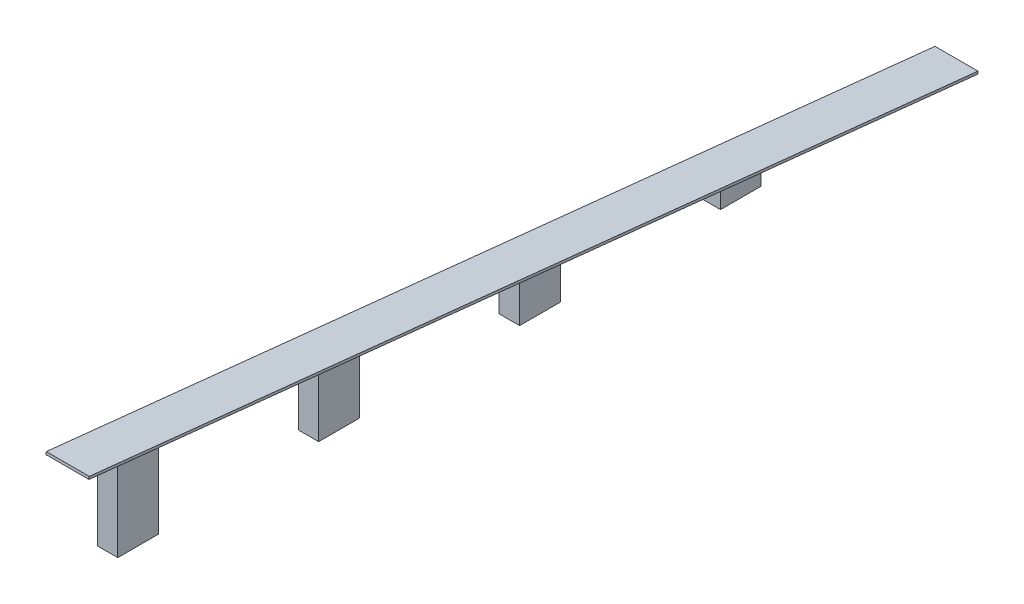
ISO-10303-21;
HEADER;
FILE_DESCRIPTION(('STEP AP214'),'2;1');
FILE_NAME('part.step','',(''),(''),'','','');
FILE_SCHEMA(('AUTOMOTIVE_DESIGN { 1 0 10303 214 1 1 1 1 }'));
ENDSEC;
DATA;
#1=APPLICATION_CONTEXT('core data for automotive mechanical design processes');
#2=APPLICATION_PROTOCOL_DEFINITION('international standard','automotive_design',2000,#1);
#3=PRODUCT_CONTEXT('',#1,'mechanical');
#4=PRODUCT('Part','Part','',(#3));
#5=PRODUCT_RELATED_PRODUCT_CATEGORY('part','',(#4));
#6=PRODUCT_DEFINITION_FORMATION('','',#4);
#7=PRODUCT_DEFINITION_CONTEXT('part definition',#1,'design');
#8=PRODUCT_DEFINITION('design','',#6,#7);
#9=PRODUCT_DEFINITION_SHAPE('','',#8);
#10=(LENGTH_UNIT() NAMED_UNIT(*) SI_UNIT(.MILLI.,.METRE.));
#11=(NAMED_UNIT(*) PLANE_ANGLE_UNIT() SI_UNIT($,.RADIAN.));
#12=(NAMED_UNIT(*) SI_UNIT($,.STERADIAN.) SOLID_ANGLE_UNIT());
#13=UNCERTAINTY_MEASURE_WITH_UNIT(LENGTH_MEASURE(1.E-05),#10,'distance_accuracy_value','');
#14=(GEOMETRIC_REPRESENTATION_CONTEXT(3) GLOBAL_UNCERTAINTY_ASSIGNED_CONTEXT((#13)) GLOBAL_UNIT_ASSIGNED_CONTEXT((#10,
#11,#12)) REPRESENTATION_CONTEXT('',''));
#15=CARTESIAN_POINT('',(0.,0.,0.));
#16=DIRECTION('',(0.,0.,1.));
#17=DIRECTION('',(1.,0.,0.));
#18=AXIS2_PLACEMENT_3D('',#15,#16,#17);
#19=CARTESIAN_POINT('',(42.6999999999999,-199.318851276045,-1516.44312212912));
#20=DIRECTION('',(0.,0.,-1.));
#21=DIRECTION('',(-1.,0.,0.));
#22=AXIS2_PLACEMENT_3D('',#19,#20,#21);
#23=PLANE('',#22);
#24=DIRECTION('',(0.,-1.,0.));
#25=VECTOR('',#24,1.);
#26=CARTESIAN_POINT('',(17.2999999999999,-199.318851276045,-1516.44312212912));
#27=LINE('',#26,#25);
#28=CARTESIAN_POINT('',(17.2999999999999,-167.058705320823,-1516.44312212912));
#29=VERTEX_POINT('',#28);
#30=CARTESIAN_POINT('',(17.2999999999999,-199.318851276045,-1516.44312212912));
#31=VERTEX_POINT('',#30);
#32=EDGE_CURVE('E12',#29,#31,#27,.T.);
#33=ORIENTED_EDGE('',*,*,#32,.T.);
#34=DIRECTION('',(-1.,0.,0.));
#35=VECTOR('',#34,1.);
#36=CARTESIAN_POINT('',(42.6999999999999,-199.318851276045,-1516.44312212912));
#37=LINE('',#36,#35);
#38=CARTESIAN_POINT('',(42.6999999999999,-199.318851276045,-1516.44312212912));
#39=VERTEX_POINT('',#38);
#40=EDGE_CURVE('E129',#39,#31,#37,.T.);
#41=ORIENTED_EDGE('',*,*,#40,.F.);
#42=DIRECTION('',(0.,-1.,0.));
#43=VECTOR('',#42,1.);
#44=CARTESIAN_POINT('',(42.6999999999999,-199.318851276045,-1516.44312212912));
#45=LINE('',#44,#43);
#46=CARTESIAN_POINT('',(42.6999999999999,-167.058705320823,-1516.44312212912));
#47=VERTEX_POINT('',#46);
#48=EDGE_CURVE('E62',#47,#39,#45,.T.);
#49=ORIENTED_EDGE('',*,*,#48,.F.);
#50=DIRECTION('',(-1.,0.,0.));
#51=VECTOR('',#50,1.);
#52=CARTESIAN_POINT('',(42.6999999999999,-167.058705320823,-1516.44312212912));
#53=LINE('',#52,#51);
#54=EDGE_CURVE('E117',#47,#29,#53,.T.);
#55=ORIENTED_EDGE('',*,*,#54,.T.);
#56=EDGE_LOOP('',(#33,#41,#49,#55));
#57=FACE_BOUND('',#56,.T.);
#58=ADVANCED_FACE('F58',(#57),#23,.F.);
#59=CARTESIAN_POINT('',(42.6999999999999,-199.318851276045,-1567.24312212912));
#60=DIRECTION('',(0.,1.,0.));
#61=DIRECTION('',(0.,0.,1.));
#62=AXIS2_PLACEMENT_3D('',#59,#60,#61);
#63=PLANE('',#62);
#64=DIRECTION('',(0.,0.,-1.));
#65=VECTOR('',#64,1.);
#66=CARTESIAN_POINT('',(17.2999999999999,-199.318851276045,-1567.24312212912));
#67=LINE('',#66,#65);
#68=CARTESIAN_POINT('',(17.2999999999999,-199.318851276045,-1567.24312212912));
#69=VERTEX_POINT('',#68);
#70=EDGE_CURVE('E68',#31,#69,#67,.T.);
#71=ORIENTED_EDGE('',*,*,#70,.T.);
#72=DIRECTION('',(-1.,0.,0.));
#73=VECTOR('',#72,1.);
#74=CARTESIAN_POINT('',(42.6999999999999,-199.318851276045,-1567.24312212912));
#75=LINE('',#74,#73);
#76=CARTESIAN_POINT('',(42.6999999999999,-199.318851276045,-1567.24312212912));
#77=VERTEX_POINT('',#76);
#78=EDGE_CURVE('E113',#77,#69,#75,.T.);
#79=ORIENTED_EDGE('',*,*,#78,.F.);
#80=DIRECTION('',(0.,0.,-1.));
#81=VECTOR('',#80,1.);
#82=CARTESIAN_POINT('',(42.6999999999999,-199.318851276045,-1567.24312212912));
#83=LINE('',#82,#81);
#84=EDGE_CURVE('E92',#39,#77,#83,.T.);
#85=ORIENTED_EDGE('',*,*,#84,.F.);
#86=ORIENTED_EDGE('',*,*,#40,.T.);
#87=EDGE_LOOP('',(#71,#79,#85,#86));
#88=FACE_BOUND('',#87,.T.);
#89=ADVANCED_FACE('F132',(#88),#63,.F.);
#90=CARTESIAN_POINT('',(42.6999999999999,-172.398000472319,-1567.24312212912));
#91=DIRECTION('',(0.,0.,1.));
#92=DIRECTION('',(1.,0.,0.));
#93=AXIS2_PLACEMENT_3D('',#90,#91,#92);
#94=PLANE('',#93);
#95=DIRECTION('',(0.,1.,0.));
#96=VECTOR('',#95,1.);
#97=CARTESIAN_POINT('',(17.2999999999999,-172.398000472319,-1567.24312212912));
#98=LINE('',#97,#96);
#99=CARTESIAN_POINT('',(17.2999999999999,-172.398000472319,-1567.24312212912));
#100=VERTEX_POINT('',#99);
#101=EDGE_CURVE('E108',#69,#100,#98,.T.);
#102=ORIENTED_EDGE('',*,*,#101,.T.);
#103=DIRECTION('',(-1.,0.,0.));
#104=VECTOR('',#103,1.);
#105=CARTESIAN_POINT('',(42.6999999999999,-172.398000472319,-1567.24312212912));
#106=LINE('',#105,#104);
#107=CARTESIAN_POINT('',(42.6999999999999,-172.398000472319,-1567.24312212912));
#108=VERTEX_POINT('',#107);
#109=EDGE_CURVE('E111',#108,#100,#106,.T.);
#110=ORIENTED_EDGE('',*,*,#109,.F.);
#111=DIRECTION('',(0.,1.,0.));
#112=VECTOR('',#111,1.);
#113=CARTESIAN_POINT('',(42.6999999999999,-172.398000472319,-1567.24312212912));
#114=LINE('',#113,#112);
#115=EDGE_CURVE('E125',#77,#108,#114,.T.);
#116=ORIENTED_EDGE('',*,*,#115,.F.);
#117=ORIENTED_EDGE('',*,*,#78,.T.);
#118=EDGE_LOOP('',(#102,#110,#116,#117));
#119=FACE_BOUND('',#118,.T.);
#120=ADVANCED_FACE('F109',(#119),#94,.F.);
#121=CARTESIAN_POINT('',(42.6999999999999,-167.058705320823,-1516.44312212912));
#122=DIRECTION('',(0.,-0.994521895368274,0.104528463267647));
#123=DIRECTION('',(0.,-0.104528463267647,-0.994521895368274));
#124=AXIS2_PLACEMENT_3D('',#121,#122,#123);
#125=PLANE('',#124);
#126=DIRECTION('',(0.,0.104528463267647,0.994521895368274));
#127=VECTOR('',#126,1.);
#128=CARTESIAN_POINT('',(17.2999999999999,-167.058705320823,-1516.44312212912));
#129=LINE('',#128,#127);
#130=EDGE_CURVE('E102',#100,#29,#129,.T.);
#131=ORIENTED_EDGE('',*,*,#130,.T.);
#132=ORIENTED_EDGE('',*,*,#54,.F.);
#133=DIRECTION('',(0.,0.104528463267647,0.994521895368274));
#134=VECTOR('',#133,1.);
#135=CARTESIAN_POINT('',(42.6999999999999,-167.058705320823,-1516.44312212912));
#136=LINE('',#135,#134);
#137=EDGE_CURVE('E116',#108,#47,#136,.T.);
#138=ORIENTED_EDGE('',*,*,#137,.F.);
#139=ORIENTED_EDGE('',*,*,#109,.T.);
#140=EDGE_LOOP('',(#131,#132,#138,#139));
#141=FACE_BOUND('',#140,.T.);
#142=ADVANCED_FACE('F115',(#141),#125,.F.);
#143=CARTESIAN_POINT('',(42.6999999999998,0.,0.));
#144=DIRECTION('',(1.,0.,0.));
#145=DIRECTION('',(0.,0.,-1.));
#146=AXIS2_PLACEMENT_3D('',#143,#144,#145);
#147=PLANE('',#146);
#148=ORIENTED_EDGE('',*,*,#48,.T.);
#149=ORIENTED_EDGE('',*,*,#84,.T.);
#150=ORIENTED_EDGE('',*,*,#115,.T.);
#151=ORIENTED_EDGE('',*,*,#137,.T.);
#152=EDGE_LOOP('',(#148,#149,#150,#151));
#153=FACE_BOUND('',#152,.T.);
#154=ADVANCED_FACE('F60',(#153),#147,.T.);
#155=CARTESIAN_POINT('',(17.2999999999998,0.,0.));
#156=DIRECTION('',(1.,0.,0.));
#157=DIRECTION('',(0.,0.,-1.));
#158=AXIS2_PLACEMENT_3D('',#155,#156,#157);
#159=PLANE('',#158);
#160=ORIENTED_EDGE('',*,*,#32,.F.);
#161=ORIENTED_EDGE('',*,*,#130,.F.);
#162=ORIENTED_EDGE('',*,*,#101,.F.);
#163=ORIENTED_EDGE('',*,*,#70,.F.);
#164=EDGE_LOOP('',(#160,#161,#162,#163));
#165=FACE_BOUND('',#164,.T.);
#166=ADVANCED_FACE('F119',(#165),#159,.F.);
#167=CLOSED_SHELL('',(#58,#89,#120,#142,#154,#166));
#168=MANIFOLD_SOLID_BREP('B2',#167);
#169=CARTESIAN_POINT('',(42.6999999999999,-199.318851276045,-1265.64312212913));
#170=DIRECTION('',(0.,0.,-1.));
#171=DIRECTION('',(-1.,0.,0.));
#172=AXIS2_PLACEMENT_3D('',#169,#170,#171);
#173=PLANE('',#172);
#174=DIRECTION('',(0.,-1.,0.));
#175=VECTOR('',#174,1.);
#176=CARTESIAN_POINT('',(17.2999999999999,-199.318851276045,-1265.64312212913));
#177=LINE('',#176,#175);
#178=CARTESIAN_POINT('',(17.2999999999999,-140.698563116193,-1265.64312212913));
#179=VERTEX_POINT('',#178);
#180=CARTESIAN_POINT('',(17.2999999999999,-199.318851276045,-1265.64312212913));
#181=VERTEX_POINT('',#180);
#182=EDGE_CURVE('E56',#179,#181,#177,.T.);
#183=ORIENTED_EDGE('',*,*,#182,.T.);
#184=DIRECTION('',(-1.,0.,0.));
#185=VECTOR('',#184,1.);
#186=CARTESIAN_POINT('',(42.6999999999999,-199.318851276045,-1265.64312212913));
#187=LINE('',#186,#185);
#188=CARTESIAN_POINT('',(42.6999999999999,-199.318851276045,-1265.64312212913));
#189=VERTEX_POINT('',#188);
#190=EDGE_CURVE('E263',#189,#181,#187,.T.);
#191=ORIENTED_EDGE('',*,*,#190,.F.);
#192=DIRECTION('',(0.,-1.,0.));
#193=VECTOR('',#192,1.);
#194=CARTESIAN_POINT('',(42.6999999999999,-199.318851276045,-1265.64312212913));
#195=LINE('',#194,#193);
#196=CARTESIAN_POINT('',(42.6999999999999,-140.698563116193,-1265.64312212913));
#197=VERTEX_POINT('',#196);
#198=EDGE_CURVE('E196',#197,#189,#195,.T.);
#199=ORIENTED_EDGE('',*,*,#198,.F.);
#200=DIRECTION('',(-1.,0.,0.));
#201=VECTOR('',#200,1.);
#202=CARTESIAN_POINT('',(42.6999999999999,-140.698563116193,-1265.64312212913));
#203=LINE('',#202,#201);
#204=EDGE_CURVE('E251',#197,#179,#203,.T.);
#205=ORIENTED_EDGE('',*,*,#204,.T.);
#206=EDGE_LOOP('',(#183,#191,#199,#205));
#207=FACE_BOUND('',#206,.T.);
#208=ADVANCED_FACE('F192',(#207),#173,.F.);
#209=CARTESIAN_POINT('',(42.6999999999999,-199.318851276045,-1316.44312212912));
#210=DIRECTION('',(0.,1.,0.));
#211=DIRECTION('',(-1.,0.,0.));
#212=AXIS2_PLACEMENT_3D('',#209,#210,#211);
#213=PLANE('',#212);
#214=DIRECTION('',(0.,0.,-1.));
#215=VECTOR('',#214,1.);
#216=CARTESIAN_POINT('',(17.2999999999999,-199.318851276045,-1316.44312212912));
#217=LINE('',#216,#215);
#218=CARTESIAN_POINT('',(17.2999999999999,-199.318851276045,-1316.44312212912));
#219=VERTEX_POINT('',#218);
#220=EDGE_CURVE('E202',#181,#219,#217,.T.);
#221=ORIENTED_EDGE('',*,*,#220,.T.);
#222=DIRECTION('',(-1.,0.,0.));
#223=VECTOR('',#222,1.);
#224=CARTESIAN_POINT('',(42.6999999999999,-199.318851276045,-1316.44312212912));
#225=LINE('',#224,#223);
#226=CARTESIAN_POINT('',(42.6999999999999,-199.318851276045,-1316.44312212912));
#227=VERTEX_POINT('',#226);
#228=EDGE_CURVE('E247',#227,#219,#225,.T.);
#229=ORIENTED_EDGE('',*,*,#228,.F.);
#230=DIRECTION('',(0.,0.,-1.));
#231=VECTOR('',#230,1.);
#232=CARTESIAN_POINT('',(42.6999999999999,-199.318851276045,-1316.44312212912));
#233=LINE('',#232,#231);
#234=EDGE_CURVE('E226',#189,#227,#233,.T.);
#235=ORIENTED_EDGE('',*,*,#234,.F.);
#236=ORIENTED_EDGE('',*,*,#190,.T.);
#237=EDGE_LOOP('',(#221,#229,#235,#236));
#238=FACE_BOUND('',#237,.T.);
#239=ADVANCED_FACE('F266',(#238),#213,.F.);
#240=CARTESIAN_POINT('',(42.6999999999999,-146.037858267689,-1316.44312212912));
#241=DIRECTION('',(0.,0.,1.));
#242=DIRECTION('',(1.,0.,0.));
#243=AXIS2_PLACEMENT_3D('',#240,#241,#242);
#244=PLANE('',#243);
#245=DIRECTION('',(0.,1.,0.));
#246=VECTOR('',#245,1.);
#247=CARTESIAN_POINT('',(17.2999999999999,-146.037858267689,-1316.44312212912));
#248=LINE('',#247,#246);
#249=CARTESIAN_POINT('',(17.2999999999999,-146.037858267689,-1316.44312212912));
#250=VERTEX_POINT('',#249);
#251=EDGE_CURVE('E242',#219,#250,#248,.T.);
#252=ORIENTED_EDGE('',*,*,#251,.T.);
#253=DIRECTION('',(-1.,0.,0.));
#254=VECTOR('',#253,1.);
#255=CARTESIAN_POINT('',(42.6999999999999,-146.037858267689,-1316.44312212912));
#256=LINE('',#255,#254);
#257=CARTESIAN_POINT('',(42.6999999999999,-146.037858267689,-1316.44312212912));
#258=VERTEX_POINT('',#257);
#259=EDGE_CURVE('E245',#258,#250,#256,.T.);
#260=ORIENTED_EDGE('',*,*,#259,.F.);
#261=DIRECTION('',(0.,1.,0.));
#262=VECTOR('',#261,1.);
#263=CARTESIAN_POINT('',(42.6999999999999,-146.037858267689,-1316.44312212912));
#264=LINE('',#263,#262);
#265=EDGE_CURVE('E259',#227,#258,#264,.T.);
#266=ORIENTED_EDGE('',*,*,#265,.F.);
#267=ORIENTED_EDGE('',*,*,#228,.T.);
#268=EDGE_LOOP('',(#252,#260,#266,#267));
#269=FACE_BOUND('',#268,.T.);
#270=ADVANCED_FACE('F243',(#269),#244,.F.);
#271=CARTESIAN_POINT('',(42.6999999999999,-140.698563116193,-1265.64312212913));
#272=DIRECTION('',(0.,-0.994521895368274,0.104528463267647));
#273=DIRECTION('',(0.,-0.104528463267647,-0.994521895368274));
#274=AXIS2_PLACEMENT_3D('',#271,#272,#273);
#275=PLANE('',#274);
#276=DIRECTION('',(0.,0.104528463267647,0.994521895368274));
#277=VECTOR('',#276,1.);
#278=CARTESIAN_POINT('',(17.2999999999999,-140.698563116193,-1265.64312212913));
#279=LINE('',#278,#277);
#280=EDGE_CURVE('E236',#250,#179,#279,.T.);
#281=ORIENTED_EDGE('',*,*,#280,.T.);
#282=ORIENTED_EDGE('',*,*,#204,.F.);
#283=DIRECTION('',(0.,0.104528463267647,0.994521895368274));
#284=VECTOR('',#283,1.);
#285=CARTESIAN_POINT('',(42.6999999999999,-140.698563116193,-1265.64312212913));
#286=LINE('',#285,#284);
#287=EDGE_CURVE('E250',#258,#197,#286,.T.);
#288=ORIENTED_EDGE('',*,*,#287,.F.);
#289=ORIENTED_EDGE('',*,*,#259,.T.);
#290=EDGE_LOOP('',(#281,#282,#288,#289));
#291=FACE_BOUND('',#290,.T.);
#292=ADVANCED_FACE('F249',(#291),#275,.F.);
#293=CARTESIAN_POINT('',(42.6999999999998,0.,0.));
#294=DIRECTION('',(1.,0.,0.));
#295=DIRECTION('',(0.,0.,-1.));
#296=AXIS2_PLACEMENT_3D('',#293,#294,#295);
#297=PLANE('',#296);
#298=ORIENTED_EDGE('',*,*,#198,.T.);
#299=ORIENTED_EDGE('',*,*,#234,.T.);
#300=ORIENTED_EDGE('',*,*,#265,.T.);
#301=ORIENTED_EDGE('',*,*,#287,.T.);
#302=EDGE_LOOP('',(#298,#299,#300,#301));
#303=FACE_BOUND('',#302,.T.);
#304=ADVANCED_FACE('F194',(#303),#297,.T.);
#305=CARTESIAN_POINT('',(17.2999999999998,0.,0.));
#306=DIRECTION('',(1.,0.,0.));
#307=DIRECTION('',(0.,0.,-1.));
#308=AXIS2_PLACEMENT_3D('',#305,#306,#307);
#309=PLANE('',#308);
#310=ORIENTED_EDGE('',*,*,#182,.F.);
#311=ORIENTED_EDGE('',*,*,#280,.F.);
#312=ORIENTED_EDGE('',*,*,#251,.F.);
#313=ORIENTED_EDGE('',*,*,#220,.F.);
#314=EDGE_LOOP('',(#310,#311,#312,#313));
#315=FACE_BOUND('',#314,.T.);
#316=ADVANCED_FACE('F253',(#315),#309,.F.);
#317=CLOSED_SHELL('',(#208,#239,#270,#292,#304,#316));
#318=MANIFOLD_SOLID_BREP('B6',#317);
#319=CARTESIAN_POINT('',(42.6999999999999,-114.338420911563,-1014.84312212913));
#320=DIRECTION('',(0.,-0.994521895368274,0.104528463267647));
#321=DIRECTION('',(0.,-0.104528463267647,-0.994521895368274));
#322=AXIS2_PLACEMENT_3D('',#319,#320,#321);
#323=PLANE('',#322);
#324=DIRECTION('',(0.,0.104528463267647,0.994521895368274));
#325=VECTOR('',#324,1.);
#326=CARTESIAN_POINT('',(17.2999999999999,-114.338420911563,-1014.84312212913));
#327=LINE('',#326,#325);
#328=CARTESIAN_POINT('',(17.2999999999999,-119.677716063059,-1065.64312212913));
#329=VERTEX_POINT('',#328);
#330=CARTESIAN_POINT('',(17.2999999999999,-114.338420911563,-1014.84312212913));
#331=VERTEX_POINT('',#330);
#332=EDGE_CURVE('E190',#329,#331,#327,.T.);
#333=ORIENTED_EDGE('',*,*,#332,.T.);
#334=DIRECTION('',(-1.,0.,0.));
#335=VECTOR('',#334,1.);
#336=CARTESIAN_POINT('',(42.6999999999999,-114.338420911563,-1014.84312212913));
#337=LINE('',#336,#335);
#338=CARTESIAN_POINT('',(42.6999999999999,-114.338420911563,-1014.84312212913));
#339=VERTEX_POINT('',#338);
#340=EDGE_CURVE('E397',#339,#331,#337,.T.);
#341=ORIENTED_EDGE('',*,*,#340,.F.);
#342=DIRECTION('',(0.,0.104528463267647,0.994521895368274));
#343=VECTOR('',#342,1.);
#344=CARTESIAN_POINT('',(42.6999999999999,-114.338420911563,-1014.84312212913));
#345=LINE('',#344,#343);
#346=CARTESIAN_POINT('',(42.6999999999999,-119.677716063059,-1065.64312212913));
#347=VERTEX_POINT('',#346);
#348=EDGE_CURVE('E330',#347,#339,#345,.T.);
#349=ORIENTED_EDGE('',*,*,#348,.F.);
#350=DIRECTION('',(-1.,0.,0.));
#351=VECTOR('',#350,1.);
#352=CARTESIAN_POINT('',(42.6999999999999,-119.677716063059,-1065.64312212913));
#353=LINE('',#352,#351);
#354=EDGE_CURVE('E385',#347,#329,#353,.T.);
#355=ORIENTED_EDGE('',*,*,#354,.T.);
#356=EDGE_LOOP('',(#333,#341,#349,#355));
#357=FACE_BOUND('',#356,.T.);
#358=ADVANCED_FACE('F326',(#357),#323,.F.);
#359=CARTESIAN_POINT('',(42.6999999999999,-199.318851276045,-1014.84312212913));
#360=DIRECTION('',(0.,0.,-1.));
#361=DIRECTION('',(-1.,0.,0.));
#362=AXIS2_PLACEMENT_3D('',#359,#360,#361);
#363=PLANE('',#362);
#364=DIRECTION('',(0.,-1.,0.));
#365=VECTOR('',#364,1.);
#366=CARTESIAN_POINT('',(17.2999999999999,-199.318851276045,-1014.84312212913));
#367=LINE('',#366,#365);
#368=CARTESIAN_POINT('',(17.2999999999999,-199.318851276045,-1014.84312212913));
#369=VERTEX_POINT('',#368);
#370=EDGE_CURVE('E336',#331,#369,#367,.T.);
#371=ORIENTED_EDGE('',*,*,#370,.T.);
#372=DIRECTION('',(-1.,0.,0.));
#373=VECTOR('',#372,1.);
#374=CARTESIAN_POINT('',(42.6999999999999,-199.318851276045,-1014.84312212913));
#375=LINE('',#374,#373);
#376=CARTESIAN_POINT('',(42.6999999999999,-199.318851276045,-1014.84312212913));
#377=VERTEX_POINT('',#376);
#378=EDGE_CURVE('E381',#377,#369,#375,.T.);
#379=ORIENTED_EDGE('',*,*,#378,.F.);
#380=DIRECTION('',(0.,-1.,0.));
#381=VECTOR('',#380,1.);
#382=CARTESIAN_POINT('',(42.6999999999999,-199.318851276045,-1014.84312212913));
#383=LINE('',#382,#381);
#384=EDGE_CURVE('E360',#339,#377,#383,.T.);
#385=ORIENTED_EDGE('',*,*,#384,.F.);
#386=ORIENTED_EDGE('',*,*,#340,.T.);
#387=EDGE_LOOP('',(#371,#379,#385,#386));
#388=FACE_BOUND('',#387,.T.);
#389=ADVANCED_FACE('F400',(#388),#363,.F.);
#390=CARTESIAN_POINT('',(42.6999999999999,-199.318851276045,-1065.64312212913));
#391=DIRECTION('',(0.,1.,0.));
#392=DIRECTION('',(-1.,0.,0.));
#393=AXIS2_PLACEMENT_3D('',#390,#391,#392);
#394=PLANE('',#393);
#395=DIRECTION('',(0.,0.,-1.));
#396=VECTOR('',#395,1.);
#397=CARTESIAN_POINT('',(17.2999999999999,-199.318851276045,-1065.64312212913));
#398=LINE('',#397,#396);
#399=CARTESIAN_POINT('',(17.2999999999999,-199.318851276045,-1065.64312212913));
#400=VERTEX_POINT('',#399);
#401=EDGE_CURVE('E376',#369,#400,#398,.T.);
#402=ORIENTED_EDGE('',*,*,#401,.T.);
#403=DIRECTION('',(-1.,0.,0.));
#404=VECTOR('',#403,1.);
#405=CARTESIAN_POINT('',(42.6999999999999,-199.318851276045,-1065.64312212913));
#406=LINE('',#405,#404);
#407=CARTESIAN_POINT('',(42.6999999999999,-199.318851276045,-1065.64312212913));
#408=VERTEX_POINT('',#407);
#409=EDGE_CURVE('E379',#408,#400,#406,.T.);
#410=ORIENTED_EDGE('',*,*,#409,.F.);
#411=DIRECTION('',(0.,0.,-1.));
#412=VECTOR('',#411,1.);
#413=CARTESIAN_POINT('',(42.6999999999999,-199.318851276045,-1065.64312212913));
#414=LINE('',#413,#412);
#415=EDGE_CURVE('E393',#377,#408,#414,.T.);
#416=ORIENTED_EDGE('',*,*,#415,.F.);
#417=ORIENTED_EDGE('',*,*,#378,.T.);
#418=EDGE_LOOP('',(#402,#410,#416,#417));
#419=FACE_BOUND('',#418,.T.);
#420=ADVANCED_FACE('F377',(#419),#394,.F.);
#421=CARTESIAN_POINT('',(42.6999999999999,-119.677716063059,-1065.64312212913));
#422=DIRECTION('',(0.,0.,1.));
#423=DIRECTION('',(1.,0.,0.));
#424=AXIS2_PLACEMENT_3D('',#421,#422,#423);
#425=PLANE('',#424);
#426=DIRECTION('',(0.,1.,0.));
#427=VECTOR('',#426,1.);
#428=CARTESIAN_POINT('',(17.2999999999999,-119.677716063059,-1065.64312212913));
#429=LINE('',#428,#427);
#430=EDGE_CURVE('E370',#400,#329,#429,.T.);
#431=ORIENTED_EDGE('',*,*,#430,.T.);
#432=ORIENTED_EDGE('',*,*,#354,.F.);
#433=DIRECTION('',(0.,1.,0.));
#434=VECTOR('',#433,1.);
#435=CARTESIAN_POINT('',(42.6999999999999,-119.677716063059,-1065.64312212913));
#436=LINE('',#435,#434);
#437=EDGE_CURVE('E384',#408,#347,#436,.T.);
#438=ORIENTED_EDGE('',*,*,#437,.F.);
#439=ORIENTED_EDGE('',*,*,#409,.T.);
#440=EDGE_LOOP('',(#431,#432,#438,#439));
#441=FACE_BOUND('',#440,.T.);
#442=ADVANCED_FACE('F383',(#441),#425,.F.);
#443=CARTESIAN_POINT('',(42.6999999999999,0.,0.));
#444=DIRECTION('',(-1.,0.,0.));
#445=DIRECTION('',(0.,-1.,0.));
#446=AXIS2_PLACEMENT_3D('',#443,#444,#445);
#447=PLANE('',#446);
#448=ORIENTED_EDGE('',*,*,#348,.T.);
#449=ORIENTED_EDGE('',*,*,#384,.T.);
#450=ORIENTED_EDGE('',*,*,#415,.T.);
#451=ORIENTED_EDGE('',*,*,#437,.T.);
#452=EDGE_LOOP('',(#448,#449,#450,#451));
#453=FACE_BOUND('',#452,.T.);
#454=ADVANCED_FACE('F328',(#453),#447,.F.);
#455=CARTESIAN_POINT('',(17.2999999999999,0.,0.));
#456=DIRECTION('',(-1.,0.,0.));
#457=DIRECTION('',(0.,-1.,0.));
#458=AXIS2_PLACEMENT_3D('',#455,#456,#457);
#459=PLANE('',#458);
#460=ORIENTED_EDGE('',*,*,#332,.F.);
#461=ORIENTED_EDGE('',*,*,#430,.F.);
#462=ORIENTED_EDGE('',*,*,#401,.F.);
#463=ORIENTED_EDGE('',*,*,#370,.F.);
#464=EDGE_LOOP('',(#460,#461,#462,#463));
#465=FACE_BOUND('',#464,.T.);
#466=ADVANCED_FACE('F387',(#465),#459,.T.);
#467=CLOSED_SHELL('',(#358,#389,#420,#442,#454,#466));
#468=MANIFOLD_SOLID_BREP('B50',#467);
#469=CARTESIAN_POINT('',(42.6999999999999,-93.3175738584294,-814.843122129125));
#470=DIRECTION('',(0.,-0.994521895368274,0.104528463267647));
#471=DIRECTION('',(0.,-0.104528463267647,-0.994521895368274));
#472=AXIS2_PLACEMENT_3D('',#469,#470,#471);
#473=PLANE('',#472);
#474=DIRECTION('',(0.,0.104528463267647,0.994521895368274));
#475=VECTOR('',#474,1.);
#476=CARTESIAN_POINT('',(17.2999999999999,-93.3175738584294,-814.843122129125));
#477=LINE('',#476,#475);
#478=CARTESIAN_POINT('',(17.2999999999999,-93.3175738584294,-814.843122129125));
#479=VERTEX_POINT('',#478);
#480=CARTESIAN_POINT('',(17.2999999999999,-87.9782787069334,-764.043122129125));
#481=VERTEX_POINT('',#480);
#482=EDGE_CURVE('E522',#479,#481,#477,.T.);
#483=ORIENTED_EDGE('',*,*,#482,.T.);
#484=DIRECTION('',(-1.,0.,0.));
#485=VECTOR('',#484,1.);
#486=CARTESIAN_POINT('',(42.6999999999999,-87.9782787069334,-764.043122129125));
#487=LINE('',#486,#485);
#488=CARTESIAN_POINT('',(42.6999999999999,-87.9782787069334,-764.043122129125));
#489=VERTEX_POINT('',#488);
#490=EDGE_CURVE('E324',#489,#481,#487,.T.);
#491=ORIENTED_EDGE('',*,*,#490,.F.);
#492=DIRECTION('',(0.,0.104528463267647,0.994521895368274));
#493=VECTOR('',#492,1.);
#494=CARTESIAN_POINT('',(42.6999999999999,-93.3175738584294,-814.843122129125));
#495=LINE('',#494,#493);
#496=CARTESIAN_POINT('',(42.6999999999999,-93.3175738584294,-814.843122129125));
#497=VERTEX_POINT('',#496);
#498=EDGE_CURVE('E510',#497,#489,#495,.T.);
#499=ORIENTED_EDGE('',*,*,#498,.F.);
#500=DIRECTION('',(-1.,0.,0.));
#501=VECTOR('',#500,1.);
#502=CARTESIAN_POINT('',(42.6999999999999,-93.3175738584294,-814.843122129125));
#503=LINE('',#502,#501);
#504=EDGE_CURVE('E518',#497,#479,#503,.T.);
#505=ORIENTED_EDGE('',*,*,#504,.T.);
#506=EDGE_LOOP('',(#483,#491,#499,#505));
#507=FACE_BOUND('',#506,.T.);
#508=ADVANCED_FACE('F459',(#507),#473,.F.);
#509=CARTESIAN_POINT('',(42.6999999999999,-87.9782787069334,-764.043122129125));
#510=DIRECTION('',(0.,0.,-1.));
#511=DIRECTION('',(-1.,0.,0.));
#512=AXIS2_PLACEMENT_3D('',#509,#510,#511);
#513=PLANE('',#512);
#514=DIRECTION('',(0.,-1.,0.));
#515=VECTOR('',#514,1.);
#516=CARTESIAN_POINT('',(17.2999999999999,-87.9782787069334,-764.043122129125));
#517=LINE('',#516,#515);
#518=CARTESIAN_POINT('',(17.2999999999999,-199.318851276045,-764.043122129125));
#519=VERTEX_POINT('',#518);
#520=EDGE_CURVE('E514',#481,#519,#517,.T.);
#521=ORIENTED_EDGE('',*,*,#520,.T.);
#522=DIRECTION('',(-1.,0.,0.));
#523=VECTOR('',#522,1.);
#524=CARTESIAN_POINT('',(42.6999999999999,-199.318851276045,-764.043122129125));
#525=LINE('',#524,#523);
#526=CARTESIAN_POINT('',(42.6999999999999,-199.318851276045,-764.043122129125));
#527=VERTEX_POINT('',#526);
#528=EDGE_CURVE('E467',#527,#519,#525,.T.);
#529=ORIENTED_EDGE('',*,*,#528,.F.);
#530=DIRECTION('',(0.,-1.,0.));
#531=VECTOR('',#530,1.);
#532=CARTESIAN_POINT('',(42.6999999999999,-87.9782787069334,-764.043122129125));
#533=LINE('',#532,#531);
#534=EDGE_CURVE('E505',#489,#527,#533,.T.);
#535=ORIENTED_EDGE('',*,*,#534,.F.);
#536=ORIENTED_EDGE('',*,*,#490,.T.);
#537=EDGE_LOOP('',(#521,#529,#535,#536));
#538=FACE_BOUND('',#537,.T.);
#539=ADVANCED_FACE('F513',(#538),#513,.F.);
#540=CARTESIAN_POINT('',(42.6999999999999,-199.318851276045,-764.043122129125));
#541=DIRECTION('',(0.,1.,0.));
#542=DIRECTION('',(-1.,0.,0.));
#543=AXIS2_PLACEMENT_3D('',#540,#541,#542);
#544=PLANE('',#543);
#545=DIRECTION('',(0.,0.,-1.));
#546=VECTOR('',#545,1.);
#547=CARTESIAN_POINT('',(17.2999999999999,-199.318851276045,-764.043122129125));
#548=LINE('',#547,#546);
#549=CARTESIAN_POINT('',(17.2999999999999,-199.318851276045,-814.843122129125));
#550=VERTEX_POINT('',#549);
#551=EDGE_CURVE('E492',#519,#550,#548,.T.);
#552=ORIENTED_EDGE('',*,*,#551,.T.);
#553=DIRECTION('',(-1.,0.,0.));
#554=VECTOR('',#553,1.);
#555=CARTESIAN_POINT('',(42.6999999999999,-199.318851276045,-814.843122129125));
#556=LINE('',#555,#554);
#557=CARTESIAN_POINT('',(42.6999999999999,-199.318851276045,-814.843122129125));
#558=VERTEX_POINT('',#557);
#559=EDGE_CURVE('E515',#558,#550,#556,.T.);
#560=ORIENTED_EDGE('',*,*,#559,.F.);
#561=DIRECTION('',(0.,0.,-1.));
#562=VECTOR('',#561,1.);
#563=CARTESIAN_POINT('',(42.6999999999999,-199.318851276045,-764.043122129125));
#564=LINE('',#563,#562);
#565=EDGE_CURVE('E508',#527,#558,#564,.T.);
#566=ORIENTED_EDGE('',*,*,#565,.F.);
#567=ORIENTED_EDGE('',*,*,#528,.T.);
#568=EDGE_LOOP('',(#552,#560,#566,#567));
#569=FACE_BOUND('',#568,.T.);
#570=ADVANCED_FACE('F516',(#569),#544,.F.);
#571=CARTESIAN_POINT('',(42.6999999999999,-199.318851276045,-814.843122129125));
#572=DIRECTION('',(0.,0.,1.));
#573=DIRECTION('',(1.,0.,0.));
#574=AXIS2_PLACEMENT_3D('',#571,#572,#573);
#575=PLANE('',#574);
#576=DIRECTION('',(0.,1.,0.));
#577=VECTOR('',#576,1.);
#578=CARTESIAN_POINT('',(17.2999999999999,-199.318851276045,-814.843122129125));
#579=LINE('',#578,#577);
#580=EDGE_CURVE('E498',#550,#479,#579,.T.);
#581=ORIENTED_EDGE('',*,*,#580,.T.);
#582=ORIENTED_EDGE('',*,*,#504,.F.);
#583=DIRECTION('',(0.,1.,0.));
#584=VECTOR('',#583,1.);
#585=CARTESIAN_POINT('',(42.6999999999999,-199.318851276045,-814.843122129125));
#586=LINE('',#585,#584);
#587=EDGE_CURVE('E475',#558,#497,#586,.T.);
#588=ORIENTED_EDGE('',*,*,#587,.F.);
#589=ORIENTED_EDGE('',*,*,#559,.T.);
#590=EDGE_LOOP('',(#581,#582,#588,#589));
#591=FACE_BOUND('',#590,.T.);
#592=ADVANCED_FACE('F529',(#591),#575,.F.);
#593=CARTESIAN_POINT('',(42.6999999999999,0.,0.));
#594=DIRECTION('',(1.,0.,0.));
#595=DIRECTION('',(0.,0.,-1.));
#596=AXIS2_PLACEMENT_3D('',#593,#594,#595);
#597=PLANE('',#596);
#598=ORIENTED_EDGE('',*,*,#498,.T.);
#599=ORIENTED_EDGE('',*,*,#534,.T.);
#600=ORIENTED_EDGE('',*,*,#565,.T.);
#601=ORIENTED_EDGE('',*,*,#587,.T.);
#602=EDGE_LOOP('',(#598,#599,#600,#601));
#603=FACE_BOUND('',#602,.T.);
#604=ADVANCED_FACE('F506',(#603),#597,.T.);
#605=CARTESIAN_POINT('',(17.2999999999999,0.,0.));
#606=DIRECTION('',(1.,0.,0.));
#607=DIRECTION('',(0.,0.,-1.));
#608=AXIS2_PLACEMENT_3D('',#605,#606,#607);
#609=PLANE('',#608);
#610=ORIENTED_EDGE('',*,*,#482,.F.);
#611=ORIENTED_EDGE('',*,*,#580,.F.);
#612=ORIENTED_EDGE('',*,*,#551,.F.);
#613=ORIENTED_EDGE('',*,*,#520,.F.);
#614=EDGE_LOOP('',(#610,#611,#612,#613));
#615=FACE_BOUND('',#614,.T.);
#616=ADVANCED_FACE('F532',(#615),#609,.F.);
#617=CLOSED_SHELL('',(#508,#539,#570,#592,#604,#616));
#618=MANIFOLD_SOLID_BREP('B184',#617);
#619=CARTESIAN_POINT('',(56.8249999999999,-150.319090417385,-1387.55082695585));
#620=DIRECTION('',(1.,0.,0.));
#621=DIRECTION('',(0.,-0.104528463267647,-0.994521895368274));
#622=AXIS2_PLACEMENT_3D('',#619,#620,#621);
#623=PLANE('',#622);
#624=DIRECTION('',(0.,0.994521895368274,-0.104528463267647));
#625=VECTOR('',#624,1.);
#626=CARTESIAN_POINT('',(56.8249999999999,-79.5654599258556,-714.375));
#627=LINE('',#626,#625);
#628=CARTESIAN_POINT('',(56.8249999999999,-82.7230669436499,-714.043122129125));
#629=VERTEX_POINT('',#628);
#630=CARTESIAN_POINT('',(56.8249999999999,-79.5654599258556,-714.375));
#631=VERTEX_POINT('',#630);
#632=EDGE_CURVE('E457',#629,#631,#627,.T.);
#633=ORIENTED_EDGE('',*,*,#632,.F.);
#634=DIRECTION('',(0.,-0.104528463267647,-0.994521895368274));
#635=VECTOR('',#634,1.);
#636=CARTESIAN_POINT('',(56.8249999999999,-153.476697435179,-1387.21894908497));
#637=LINE('',#636,#635);
#638=CARTESIAN_POINT('',(56.8249999999999,-199.318851276045,-1823.37790809354));
#639=VERTEX_POINT('',#638);
#640=EDGE_CURVE('E639',#629,#639,#637,.T.);
#641=ORIENTED_EDGE('',*,*,#640,.T.);
#642=DIRECTION('',(0.,0.994521895368274,-0.104528463267647));
#643=VECTOR('',#642,1.);
#644=CARTESIAN_POINT('',(56.8249999999999,-196.16124425825,-1823.70978596441));
#645=LINE('',#644,#643);
#646=CARTESIAN_POINT('',(56.8249999999999,-196.16124425825,-1823.70978596441));
#647=VERTEX_POINT('',#646);
#648=EDGE_CURVE('E594',#639,#647,#645,.T.);
#649=ORIENTED_EDGE('',*,*,#648,.T.);
#650=DIRECTION('',(0.,-0.104528463267647,-0.994521895368274));
#651=VECTOR('',#650,1.);
#652=CARTESIAN_POINT('',(56.8249999999999,-150.319090417385,-1387.55082695585));
#653=LINE('',#652,#651);
#654=EDGE_CURVE('E658',#631,#647,#653,.T.);
#655=ORIENTED_EDGE('',*,*,#654,.F.);
#656=EDGE_LOOP('',(#633,#641,#649,#655));
#657=FACE_BOUND('',#656,.T.);
#658=ADVANCED_FACE('F583',(#657),#623,.T.);
#659=CARTESIAN_POINT('',(56.8249999999999,-196.16124425825,-1823.70978596441));
#660=DIRECTION('',(0.,0.104528463267647,0.994521895368274));
#661=DIRECTION('',(1.,0.,0.));
#662=AXIS2_PLACEMENT_3D('',#659,#660,#661);
#663=PLANE('',#662);
#664=ORIENTED_EDGE('',*,*,#648,.F.);
#665=DIRECTION('',(-1.,0.,0.));
#666=VECTOR('',#665,1.);
#667=CARTESIAN_POINT('',(1178.62031209504,-199.318851276045,-1823.37790809354));
#668=LINE('',#667,#666);
#669=CARTESIAN_POINT('',(3.17499999999993,-199.318851276045,-1823.37790809354));
#670=VERTEX_POINT('',#669);
#671=EDGE_CURVE('E648',#670,#639,#668,.F.);
#672=ORIENTED_EDGE('',*,*,#671,.F.);
#673=DIRECTION('',(0.,0.994521895368274,-0.104528463267647));
#674=VECTOR('',#673,1.);
#675=CARTESIAN_POINT('',(3.175,-196.16124425825,-1823.70978596441));
#676=LINE('',#675,#674);
#677=CARTESIAN_POINT('',(3.175,-196.16124425825,-1823.70978596441));
#678=VERTEX_POINT('',#677);
#679=EDGE_CURVE('E602',#670,#678,#676,.T.);
#680=ORIENTED_EDGE('',*,*,#679,.T.);
#681=DIRECTION('',(1.,0.,0.));
#682=VECTOR('',#681,1.);
#683=CARTESIAN_POINT('',(56.8249999999999,-196.16124425825,-1823.70978596441));
#684=LINE('',#683,#682);
#685=EDGE_CURVE('E633',#678,#647,#684,.T.);
#686=ORIENTED_EDGE('',*,*,#685,.T.);
#687=EDGE_LOOP('',(#664,#672,#680,#686));
#688=FACE_BOUND('',#687,.T.);
#689=ADVANCED_FACE('F663',(#688),#663,.F.);
#690=CARTESIAN_POINT('',(3.175,-150.319090417385,-1387.55082695585));
#691=DIRECTION('',(-1.,0.,0.));
#692=DIRECTION('',(0.,0.104528463267647,0.994521895368274));
#693=AXIS2_PLACEMENT_3D('',#690,#691,#692);
#694=PLANE('',#693);
#695=ORIENTED_EDGE('',*,*,#679,.F.);
#696=DIRECTION('',(0.,-0.104528463267647,-0.994521895368274));
#697=VECTOR('',#696,1.);
#698=CARTESIAN_POINT('',(3.17499999999993,-153.476697435179,-1387.21894908497));
#699=LINE('',#698,#697);
#700=CARTESIAN_POINT('',(3.17499999999993,-82.7230669436499,-714.043122129125));
#701=VERTEX_POINT('',#700);
#702=EDGE_CURVE('E638',#670,#701,#699,.F.);
#703=ORIENTED_EDGE('',*,*,#702,.T.);
#704=DIRECTION('',(0.,0.994521895368274,-0.104528463267647));
#705=VECTOR('',#704,1.);
#706=CARTESIAN_POINT('',(3.175,-79.5654599258556,-714.375));
#707=LINE('',#706,#705);
#708=CARTESIAN_POINT('',(3.175,-79.5654599258556,-714.375));
#709=VERTEX_POINT('',#708);
#710=EDGE_CURVE('E587',#701,#709,#707,.T.);
#711=ORIENTED_EDGE('',*,*,#710,.T.);
#712=DIRECTION('',(0.,0.104528463267647,0.994521895368274));
#713=VECTOR('',#712,1.);
#714=CARTESIAN_POINT('',(3.175,-150.319090417385,-1387.55082695585));
#715=LINE('',#714,#713);
#716=EDGE_CURVE('E651',#678,#709,#715,.T.);
#717=ORIENTED_EDGE('',*,*,#716,.F.);
#718=EDGE_LOOP('',(#695,#703,#711,#717));
#719=FACE_BOUND('',#718,.T.);
#720=ADVANCED_FACE('F642',(#719),#694,.T.);
#721=CARTESIAN_POINT('',(1178.62031209504,-79.5654599258556,-714.375));
#722=DIRECTION('',(0.,-0.104528463267647,-0.994521895368274));
#723=DIRECTION('',(-1.,0.,0.));
#724=AXIS2_PLACEMENT_3D('',#721,#722,#723);
#725=PLANE('',#724);
#726=DIRECTION('',(-1.,0.,0.));
#727=VECTOR('',#726,1.);
#728=CARTESIAN_POINT('',(1178.62031209504,-82.7230669436499,-714.043122129125));
#729=LINE('',#728,#727);
#730=EDGE_CURVE('E626',#629,#701,#729,.T.);
#731=ORIENTED_EDGE('',*,*,#730,.F.);
#732=ORIENTED_EDGE('',*,*,#632,.T.);
#733=DIRECTION('',(-1.,0.,0.));
#734=VECTOR('',#733,1.);
#735=CARTESIAN_POINT('',(1178.62031209504,-79.5654599258556,-714.375));
#736=LINE('',#735,#734);
#737=EDGE_CURVE('E628',#631,#709,#736,.T.);
#738=ORIENTED_EDGE('',*,*,#737,.T.);
#739=ORIENTED_EDGE('',*,*,#710,.F.);
#740=EDGE_LOOP('',(#731,#732,#738,#739));
#741=FACE_BOUND('',#740,.T.);
#742=ADVANCED_FACE('F585',(#741),#725,.F.);
#743=CARTESIAN_POINT('',(1178.62031209504,-150.319090417385,-1387.55082695585));
#744=DIRECTION('',(0.,0.994521895368274,-0.104528463267647));
#745=DIRECTION('',(0.,-0.104528463267647,-0.994521895368274));
#746=AXIS2_PLACEMENT_3D('',#743,#744,#745);
#747=PLANE('',#746);
#748=ORIENTED_EDGE('',*,*,#716,.T.);
#749=ORIENTED_EDGE('',*,*,#737,.F.);
#750=ORIENTED_EDGE('',*,*,#654,.T.);
#751=ORIENTED_EDGE('',*,*,#685,.F.);
#752=EDGE_LOOP('',(#748,#749,#750,#751));
#753=FACE_BOUND('',#752,.T.);
#754=ADVANCED_FACE('F661',(#753),#747,.T.);
#755=CARTESIAN_POINT('',(1178.62031209504,-153.476697435179,-1387.21894908497));
#756=DIRECTION('',(0.,0.994521895368274,-0.104528463267647));
#757=DIRECTION('',(0.,-0.104528463267647,-0.994521895368274));
#758=AXIS2_PLACEMENT_3D('',#755,#756,#757);
#759=PLANE('',#758);
#760=ORIENTED_EDGE('',*,*,#702,.F.);
#761=ORIENTED_EDGE('',*,*,#671,.T.);
#762=ORIENTED_EDGE('',*,*,#640,.F.);
#763=ORIENTED_EDGE('',*,*,#730,.T.);
#764=EDGE_LOOP('',(#760,#761,#762,#763));
#765=FACE_BOUND('',#764,.T.);
#766=ADVANCED_FACE('F636',(#765),#759,.F.);
#767=CLOSED_SHELL('',(#658,#689,#720,#742,#754,#766));
#768=MANIFOLD_SOLID_BREP('B318',#767);
#769=ADVANCED_BREP_SHAPE_REPRESENTATION('',(#18,#168,#318,#468,#618,#768),#14);
#770=SHAPE_DEFINITION_REPRESENTATION(#9,#769);
ENDSEC;
END-ISO-10303-21;
